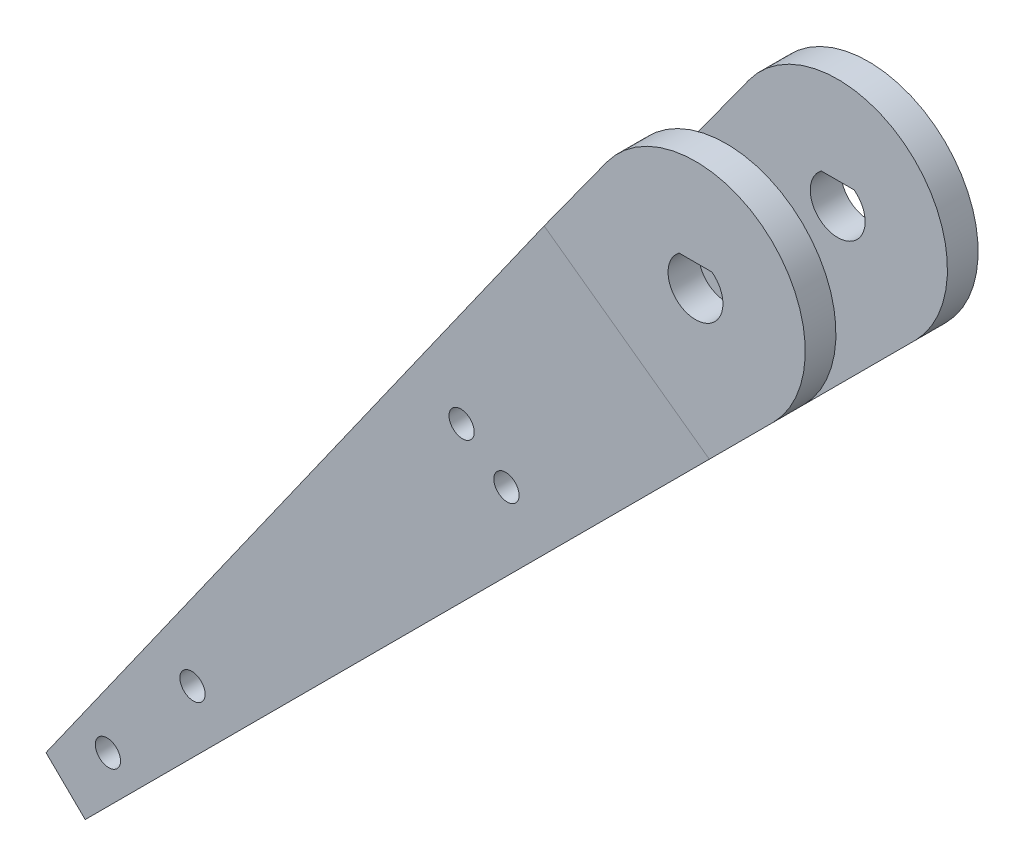
ISO-10303-21;
HEADER;
FILE_DESCRIPTION(('STEP AP214'),'2;1');
FILE_NAME('part.step','',(''),(''),'','','');
FILE_SCHEMA(('AUTOMOTIVE_DESIGN { 1 0 10303 214 1 1 1 1 }'));
ENDSEC;
DATA;
#1=APPLICATION_CONTEXT('core data for automotive mechanical design processes');
#2=APPLICATION_PROTOCOL_DEFINITION('international standard','automotive_design',2000,#1);
#3=PRODUCT_CONTEXT('',#1,'mechanical');
#4=PRODUCT('Part','Part','',(#3));
#5=PRODUCT_RELATED_PRODUCT_CATEGORY('part','',(#4));
#6=PRODUCT_DEFINITION_FORMATION('','',#4);
#7=PRODUCT_DEFINITION_CONTEXT('part definition',#1,'design');
#8=PRODUCT_DEFINITION('design','',#6,#7);
#9=PRODUCT_DEFINITION_SHAPE('','',#8);
#10=(LENGTH_UNIT() NAMED_UNIT(*) SI_UNIT(.MILLI.,.METRE.));
#11=(NAMED_UNIT(*) PLANE_ANGLE_UNIT() SI_UNIT($,.RADIAN.));
#12=(NAMED_UNIT(*) SI_UNIT($,.STERADIAN.) SOLID_ANGLE_UNIT());
#13=UNCERTAINTY_MEASURE_WITH_UNIT(LENGTH_MEASURE(1.E-05),#10,'distance_accuracy_value','');
#14=(GEOMETRIC_REPRESENTATION_CONTEXT(3) GLOBAL_UNCERTAINTY_ASSIGNED_CONTEXT((#13)) GLOBAL_UNIT_ASSIGNED_CONTEXT((#10,
#11,#12)) REPRESENTATION_CONTEXT('',''));
#15=CARTESIAN_POINT('',(0.,0.,0.));
#16=DIRECTION('',(0.,0.,1.));
#17=DIRECTION('',(1.,0.,0.));
#18=AXIS2_PLACEMENT_3D('',#15,#16,#17);
#19=CARTESIAN_POINT('',(77.8498963556851,91.3202805372886,10.));
#20=DIRECTION('',(0.,0.,-1.));
#21=DIRECTION('',(1.,0.,0.));
#22=AXIS2_PLACEMENT_3D('',#19,#20,#21);
#23=PLANE('',#22);
#24=DIRECTION('',(-0.810292579282322,0.586025542071336,0.));
#25=VECTOR('',#24,1.);
#26=CARTESIAN_POINT('',(123.400459016312,43.1747494764171,10.));
#27=LINE('',#26,#25);
#28=CARTESIAN_POINT('',(79.4506035200129,74.9604754594781,10.));
#29=VERTEX_POINT('',#28);
#30=CARTESIAN_POINT('',(60.3404163726786,88.7814804500709,10.));
#31=VERTEX_POINT('',#30);
#32=EDGE_CURVE('E433',#29,#31,#27,.T.);
#33=ORIENTED_EDGE('',*,*,#32,.F.);
#34=DIRECTION('',(0.707106781186549,0.707106781186546,0.));
#35=VECTOR('',#34,1.);
#36=CARTESIAN_POINT('',(2.24506403026728,-2.24506403026729,10.));
#37=LINE('',#36,#35);
#38=CARTESIAN_POINT('',(86.8301524767542,82.3400244162194,10.));
#39=VERTEX_POINT('',#38);
#40=EDGE_CURVE('E445',#29,#39,#37,.T.);
#41=ORIENTED_EDGE('',*,*,#40,.T.);
#42=CARTESIAN_POINT('',(77.8498963556851,91.3202805372886,10.));
#43=DIRECTION('',(0.,0.,1.));
#44=DIRECTION('',(1.,0.,0.));
#45=AXIS2_PLACEMENT_3D('',#42,#43,#44);
#46=CIRCLE('',#45,12.7);
#47=CARTESIAN_POINT('',(67.5591805987996,98.7628049215945,10.));
#48=VERTEX_POINT('',#47);
#49=EDGE_CURVE('E452',#39,#48,#46,.T.);
#50=ORIENTED_EDGE('',*,*,#49,.T.);
#51=DIRECTION('',(-0.586025542071336,-0.810292579282321,0.));
#52=VECTOR('',#51,1.);
#53=CARTESIAN_POINT('',(67.5591805987996,98.7628049215945,10.));
#54=LINE('',#53,#52);
#55=EDGE_CURVE('E449',#48,#31,#54,.T.);
#56=ORIENTED_EDGE('',*,*,#55,.T.);
#57=EDGE_LOOP('',(#33,#41,#50,#56));
#58=FACE_BOUND('',#57,.T.);
#59=CARTESIAN_POINT('',(77.8498963556851,91.3202805372886,10.));
#60=DIRECTION('',(0.,0.,-1.));
#61=DIRECTION('',(-1.,0.,0.));
#62=AXIS2_PLACEMENT_3D('',#59,#60,#61);
#63=CIRCLE('',#62,3.175);
#64=CARTESIAN_POINT('',(79.7448963556851,93.8677498697831,10.));
#65=VERTEX_POINT('',#64);
#66=CARTESIAN_POINT('',(75.9548963556851,93.8677498697831,10.));
#67=VERTEX_POINT('',#66);
#68=EDGE_CURVE('E396',#65,#67,#63,.T.);
#69=ORIENTED_EDGE('',*,*,#68,.T.);
#70=DIRECTION('',(1.,0.,0.));
#71=VECTOR('',#70,1.);
#72=CARTESIAN_POINT('',(75.9548963556851,93.8677498697831,10.));
#73=LINE('',#72,#71);
#74=EDGE_CURVE('E387',#67,#65,#73,.T.);
#75=ORIENTED_EDGE('',*,*,#74,.T.);
#76=EDGE_LOOP('',(#69,#75));
#77=FACE_BOUND('',#76,.T.);
#78=ADVANCED_FACE('F249',(#58,#77),#23,.F.);
#79=CARTESIAN_POINT('',(60.5199183520579,-43.7696442805761,6.45));
#80=DIRECTION('',(0.,0.,-1.));
#81=DIRECTION('',(-1.,0.,0.));
#82=AXIS2_PLACEMENT_3D('',#79,#80,#81);
#83=PLANE('',#82);
#84=DIRECTION('',(-0.707106781186549,-0.707106781186546,0.));
#85=VECTOR('',#84,1.);
#86=CARTESIAN_POINT('',(10.6202010660083,6.13007300547368,6.45));
#87=LINE('',#86,#85);
#88=CARTESIAN_POINT('',(86.8301524767542,82.3400244162194,6.45));
#89=VERTEX_POINT('',#88);
#90=CARTESIAN_POINT('',(68.7210810698613,64.2309530093265,6.45));
#91=VERTEX_POINT('',#90);
#92=EDGE_CURVE('E424',#89,#91,#87,.T.);
#93=ORIENTED_EDGE('',*,*,#92,.T.);
#94=DIRECTION('',(-0.810292579282322,0.586025542071336,0.));
#95=VECTOR('',#94,1.);
#96=CARTESIAN_POINT('',(114.620725943886,31.0350865335333,6.45));
#97=LINE('',#96,#95);
#98=CARTESIAN_POINT('',(51.5606833002522,76.6418175071872,6.45));
#99=VERTEX_POINT('',#98);
#100=EDGE_CURVE('E420',#91,#99,#97,.T.);
#101=ORIENTED_EDGE('',*,*,#100,.T.);
#102=DIRECTION('',(-0.586025542071336,-0.810292579282322,0.));
#103=VECTOR('',#102,1.);
#104=CARTESIAN_POINT('',(-2.54012429157569,1.83708669307776,6.45));
#105=LINE('',#104,#103);
#106=CARTESIAN_POINT('',(67.5591805987996,98.7628049215945,6.45));
#107=VERTEX_POINT('',#106);
#108=EDGE_CURVE('E417',#107,#99,#105,.T.);
#109=ORIENTED_EDGE('',*,*,#108,.F.);
#110=CARTESIAN_POINT('',(77.8498963556851,91.3202805372886,6.45));
#111=DIRECTION('',(0.,0.,-1.));
#112=DIRECTION('',(-1.,0.,0.));
#113=AXIS2_PLACEMENT_3D('',#110,#111,#112);
#114=CIRCLE('',#113,12.7);
#115=EDGE_CURVE('E409',#89,#107,#114,.F.);
#116=ORIENTED_EDGE('',*,*,#115,.F.);
#117=EDGE_LOOP('',(#93,#101,#109,#116));
#118=FACE_BOUND('',#117,.T.);
#119=DIRECTION('',(-1.,0.,0.));
#120=VECTOR('',#119,1.);
#121=CARTESIAN_POINT('',(75.9548963556851,93.8677498697831,6.45));
#122=LINE('',#121,#120);
#123=CARTESIAN_POINT('',(79.7448963556851,93.8677498697831,6.45));
#124=VERTEX_POINT('',#123);
#125=CARTESIAN_POINT('',(75.9548963556851,93.8677498697831,6.45));
#126=VERTEX_POINT('',#125);
#127=EDGE_CURVE('E397',#124,#126,#122,.T.);
#128=ORIENTED_EDGE('',*,*,#127,.T.);
#129=CARTESIAN_POINT('',(77.8498963556851,91.3202805372886,6.45));
#130=DIRECTION('',(0.,0.,1.));
#131=DIRECTION('',(1.,0.,0.));
#132=AXIS2_PLACEMENT_3D('',#129,#130,#131);
#133=CIRCLE('',#132,3.175);
#134=EDGE_CURVE('E273',#126,#124,#133,.T.);
#135=ORIENTED_EDGE('',*,*,#134,.T.);
#136=EDGE_LOOP('',(#128,#135));
#137=FACE_BOUND('',#136,.T.);
#138=ADVANCED_FACE('F581',(#118,#137),#83,.T.);
#139=CARTESIAN_POINT('',(2.24506403026728,-2.24506403026729,-10.));
#140=DIRECTION('',(0.707106781186546,-0.707106781186549,0.));
#141=DIRECTION('',(0.707106781186549,0.707106781186546,0.));
#142=AXIS2_PLACEMENT_3D('',#139,#140,#141);
#143=PLANE('',#142);
#144=DIRECTION('',(-0.706113128718452,-0.706113128718449,-0.0529952724578474));
#145=VECTOR('',#144,1.);
#146=CARTESIAN_POINT('',(10.5420140819614,6.05188602142685,2.08353890337242));
#147=LINE('',#146,#145);
#148=CARTESIAN_POINT('',(57.7506774525737,53.2605493920389,5.6266481813957));
#149=VERTEX_POINT('',#148);
#150=CARTESIAN_POINT('',(25.7509304412686,21.260802380734,3.225));
#151=VERTEX_POINT('',#150);
#152=EDGE_CURVE('E435',#149,#151,#147,.T.);
#153=ORIENTED_EDGE('',*,*,#152,.F.);
#154=DIRECTION('',(0.,0.,1.));
#155=VECTOR('',#154,1.);
#156=CARTESIAN_POINT('',(57.7506774525737,53.2605493920389,1.83788912642371E-13));
#157=LINE('',#156,#155);
#158=CARTESIAN_POINT('',(57.7506774525737,53.2605493920389,-5.6266481813957));
#159=VERTEX_POINT('',#158);
#160=EDGE_CURVE('E511',#159,#149,#157,.T.);
#161=ORIENTED_EDGE('',*,*,#160,.F.);
#162=DIRECTION('',(-0.706113128718452,-0.706113128718449,0.0529952724578474));
#163=VECTOR('',#162,1.);
#164=CARTESIAN_POINT('',(10.5420140819614,6.05188602142685,-2.08353890337242));
#165=LINE('',#164,#163);
#166=CARTESIAN_POINT('',(25.7509304412686,21.260802380734,-3.225));
#167=VERTEX_POINT('',#166);
#168=EDGE_CURVE('E523',#159,#167,#165,.T.);
#169=ORIENTED_EDGE('',*,*,#168,.T.);
#170=DIRECTION('',(0.,0.,1.));
#171=VECTOR('',#170,1.);
#172=CARTESIAN_POINT('',(25.7509304412687,21.260802380734,0.));
#173=LINE('',#172,#171);
#174=EDGE_CURVE('E509',#167,#151,#173,.T.);
#175=ORIENTED_EDGE('',*,*,#174,.T.);
#176=EDGE_LOOP('',(#153,#161,#169,#175));
#177=FACE_BOUND('',#176,.T.);
#178=DIRECTION('',(-0.706113128718452,-0.706113128718449,-0.0529952724578474));
#179=VECTOR('',#178,1.);
#180=CARTESIAN_POINT('',(10.5420140819614,6.05188602142685,2.08353890337242));
#181=LINE('',#180,#179);
#182=CARTESIAN_POINT('',(62.0476925154329,57.5575644548981,5.9491481813957));
#183=VERTEX_POINT('',#182);
#184=EDGE_CURVE('E411',#91,#183,#181,.T.);
#185=ORIENTED_EDGE('',*,*,#184,.F.);
#186=ORIENTED_EDGE('',*,*,#92,.F.);
#187=DIRECTION('',(0.,0.,-1.));
#188=VECTOR('',#187,1.);
#189=CARTESIAN_POINT('',(86.8301524767542,82.3400244162194,10.));
#190=LINE('',#189,#188);
#191=EDGE_CURVE('E455',#39,#89,#190,.T.);
#192=ORIENTED_EDGE('',*,*,#191,.F.);
#193=ORIENTED_EDGE('',*,*,#40,.F.);
#194=DIRECTION('',(0.706366518785737,0.706366518785735,0.045745844369079));
#195=VECTOR('',#194,1.);
#196=CARTESIAN_POINT('',(10.4411079009863,5.9509798404517,5.53079376977915));
#197=LINE('',#196,#195);
#198=CARTESIAN_POINT('',(2.24506403026731,-2.24506403026731,5.));
#199=VERTEX_POINT('',#198);
#200=EDGE_CURVE('E428',#199,#29,#197,.T.);
#201=ORIENTED_EDGE('',*,*,#200,.F.);
#202=DIRECTION('',(0.,0.,1.));
#203=VECTOR('',#202,1.);
#204=CARTESIAN_POINT('',(2.24506403026728,-2.24506403026729,-10.));
#205=LINE('',#204,#203);
#206=CARTESIAN_POINT('',(2.2450640302673,-2.2450640302673,-5.));
#207=VERTEX_POINT('',#206);
#208=EDGE_CURVE('E12',#207,#199,#205,.T.);
#209=ORIENTED_EDGE('',*,*,#208,.F.);
#210=DIRECTION('',(0.706366518785737,0.706366518785735,-0.045745844369079));
#211=VECTOR('',#210,1.);
#212=CARTESIAN_POINT('',(10.2518913830781,5.76176332254347,-5.51853969324793));
#213=LINE('',#212,#211);
#214=CARTESIAN_POINT('',(79.4506035200129,74.9604754594781,-10.));
#215=VERTEX_POINT('',#214);
#216=EDGE_CURVE('E476',#207,#215,#213,.T.);
#217=ORIENTED_EDGE('',*,*,#216,.T.);
#218=DIRECTION('',(0.707106781186549,0.707106781186546,0.));
#219=VECTOR('',#218,1.);
#220=CARTESIAN_POINT('',(2.24506403026728,-2.24506403026729,-10.));
#221=LINE('',#220,#219);
#222=CARTESIAN_POINT('',(86.8301524767542,82.3400244162194,-10.));
#223=VERTEX_POINT('',#222);
#224=EDGE_CURVE('E527',#215,#223,#221,.T.);
#225=ORIENTED_EDGE('',*,*,#224,.T.);
#226=DIRECTION('',(0.,0.,1.));
#227=VECTOR('',#226,1.);
#228=CARTESIAN_POINT('',(86.8301524767542,82.3400244162194,-10.));
#229=LINE('',#228,#227);
#230=CARTESIAN_POINT('',(86.8301524767542,82.3400244162194,-6.45));
#231=VERTEX_POINT('',#230);
#232=EDGE_CURVE('E534',#223,#231,#229,.T.);
#233=ORIENTED_EDGE('',*,*,#232,.T.);
#234=DIRECTION('',(-0.707106781186549,-0.707106781186546,0.));
#235=VECTOR('',#234,1.);
#236=CARTESIAN_POINT('',(10.6202010660083,6.13007300547368,-6.45));
#237=LINE('',#236,#235);
#238=CARTESIAN_POINT('',(68.7210810698613,64.2309530093265,-6.45));
#239=VERTEX_POINT('',#238);
#240=EDGE_CURVE('E500',#231,#239,#237,.T.);
#241=ORIENTED_EDGE('',*,*,#240,.T.);
#242=DIRECTION('',(-0.706113128718452,-0.706113128718449,0.0529952724578474));
#243=VECTOR('',#242,1.);
#244=CARTESIAN_POINT('',(10.5420140819614,6.05188602142685,-2.08353890337242));
#245=LINE('',#244,#243);
#246=CARTESIAN_POINT('',(62.0476925154329,57.5575644548981,-5.9491481813957));
#247=VERTEX_POINT('',#246);
#248=EDGE_CURVE('E503',#239,#247,#245,.T.);
#249=ORIENTED_EDGE('',*,*,#248,.T.);
#250=DIRECTION('',(0.,0.,1.));
#251=VECTOR('',#250,1.);
#252=CARTESIAN_POINT('',(62.0476925154329,57.5575644548981,-1.89497192169139E-13));
#253=LINE('',#252,#251);
#254=EDGE_CURVE('E483',#247,#183,#253,.T.);
#255=ORIENTED_EDGE('',*,*,#254,.T.);
#256=EDGE_LOOP('',(#185,#186,#192,#193,#201,#209,#217,#225,#233,#241,#249,#255));
#257=FACE_BOUND('',#256,.T.);
#258=ADVANCED_FACE('F251',(#177,#257),#143,.T.);
#259=CARTESIAN_POINT('',(67.5591805987996,98.7628049215945,-10.));
#260=DIRECTION('',(-0.810292579282322,0.586025542071336,0.));
#261=DIRECTION('',(-0.586025542071336,-0.810292579282322,0.));
#262=AXIS2_PLACEMENT_3D('',#259,#260,#261);
#263=PLANE('',#262);
#264=DIRECTION('',(0.,0.,1.));
#265=VECTOR('',#264,1.);
#266=CARTESIAN_POINT('',(42.5838424479172,64.2296152978165,2.09622180126904E-13));
#267=LINE('',#266,#265);
#268=CARTESIAN_POINT('',(42.5838424479172,64.2296152978166,-5.6266481813957));
#269=VERTEX_POINT('',#268);
#270=CARTESIAN_POINT('',(42.5838424479172,64.2296152978166,5.6266481813957));
#271=VERTEX_POINT('',#270);
#272=EDGE_CURVE('E513',#269,#271,#267,.T.);
#273=ORIENTED_EDGE('',*,*,#272,.T.);
#274=DIRECTION('',(-0.58518083972091,-0.809124616459689,-0.0536725242791041));
#275=VECTOR('',#274,1.);
#276=CARTESIAN_POINT('',(-2.58685639529089,1.77247060702657,1.48361193379322));
#277=LINE('',#276,#275);
#278=CARTESIAN_POINT('',(16.399150775972,28.0242627502479,3.225));
#279=VERTEX_POINT('',#278);
#280=EDGE_CURVE('E438',#271,#279,#277,.T.);
#281=ORIENTED_EDGE('',*,*,#280,.T.);
#282=DIRECTION('',(0.,0.,1.));
#283=VECTOR('',#282,1.);
#284=CARTESIAN_POINT('',(16.399150775972,28.0242627502478,0.));
#285=LINE('',#284,#283);
#286=CARTESIAN_POINT('',(16.399150775972,28.0242627502479,-3.225));
#287=VERTEX_POINT('',#286);
#288=EDGE_CURVE('E518',#287,#279,#285,.T.);
#289=ORIENTED_EDGE('',*,*,#288,.F.);
#290=DIRECTION('',(-0.58518083972091,-0.809124616459689,0.0536725242791041));
#291=VECTOR('',#290,1.);
#292=CARTESIAN_POINT('',(-2.58685639529089,1.77247060702657,-1.48361193379322));
#293=LINE('',#292,#291);
#294=EDGE_CURVE('E515',#269,#287,#293,.T.);
#295=ORIENTED_EDGE('',*,*,#294,.F.);
#296=EDGE_LOOP('',(#273,#281,#289,#295));
#297=FACE_BOUND('',#296,.T.);
#298=DIRECTION('',(0.,0.,-1.));
#299=VECTOR('',#298,1.);
#300=CARTESIAN_POINT('',(67.5591805987996,98.7628049215945,10.));
#301=LINE('',#300,#299);
#302=EDGE_CURVE('E454',#48,#107,#301,.T.);
#303=ORIENTED_EDGE('',*,*,#302,.T.);
#304=ORIENTED_EDGE('',*,*,#108,.T.);
#305=DIRECTION('',(-0.58518083972091,-0.809124616459689,-0.0536725242791041));
#306=VECTOR('',#305,1.);
#307=CARTESIAN_POINT('',(-2.58685639529089,1.77247060702657,1.48361193379322));
#308=LINE('',#307,#306);
#309=CARTESIAN_POINT('',(46.0999957003451,69.0913707735104,5.9491481813957));
#310=VERTEX_POINT('',#309);
#311=EDGE_CURVE('E414',#99,#310,#308,.T.);
#312=ORIENTED_EDGE('',*,*,#311,.T.);
#313=DIRECTION('',(0.,0.,1.));
#314=VECTOR('',#313,1.);
#315=CARTESIAN_POINT('',(46.0999957003452,69.0913707735104,-2.13531693707509E-13));
#316=LINE('',#315,#314);
#317=CARTESIAN_POINT('',(46.0999957003451,69.0913707735104,-5.9491481813957));
#318=VERTEX_POINT('',#317);
#319=EDGE_CURVE('E495',#318,#310,#316,.T.);
#320=ORIENTED_EDGE('',*,*,#319,.F.);
#321=DIRECTION('',(-0.58518083972091,-0.809124616459689,0.0536725242791041));
#322=VECTOR('',#321,1.);
#323=CARTESIAN_POINT('',(-2.58685639529089,1.77247060702657,-1.48361193379322));
#324=LINE('',#323,#322);
#325=CARTESIAN_POINT('',(51.5606833002522,76.6418175071872,-6.45));
#326=VERTEX_POINT('',#325);
#327=EDGE_CURVE('E497',#326,#318,#324,.T.);
#328=ORIENTED_EDGE('',*,*,#327,.F.);
#329=DIRECTION('',(-0.586025542071336,-0.810292579282322,0.));
#330=VECTOR('',#329,1.);
#331=CARTESIAN_POINT('',(-2.54012429157569,1.83708669307776,-6.45));
#332=LINE('',#331,#330);
#333=CARTESIAN_POINT('',(67.5591805987996,98.7628049215945,-6.45));
#334=VERTEX_POINT('',#333);
#335=EDGE_CURVE('E491',#334,#326,#332,.T.);
#336=ORIENTED_EDGE('',*,*,#335,.F.);
#337=DIRECTION('',(0.,0.,1.));
#338=VECTOR('',#337,1.);
#339=CARTESIAN_POINT('',(67.5591805987996,98.7628049215945,-10.));
#340=LINE('',#339,#338);
#341=CARTESIAN_POINT('',(67.5591805987996,98.7628049215945,-10.));
#342=VERTEX_POINT('',#341);
#343=EDGE_CURVE('E538',#342,#334,#340,.T.);
#344=ORIENTED_EDGE('',*,*,#343,.F.);
#345=DIRECTION('',(-0.586025542071336,-0.810292579282321,0.));
#346=VECTOR('',#345,1.);
#347=CARTESIAN_POINT('',(67.5591805987996,98.7628049215945,-10.));
#348=LINE('',#347,#346);
#349=CARTESIAN_POINT('',(60.3404163726786,88.7814804500709,-10.));
#350=VERTEX_POINT('',#349);
#351=EDGE_CURVE('E532',#342,#350,#348,.T.);
#352=ORIENTED_EDGE('',*,*,#351,.T.);
#353=DIRECTION('',(0.58539623748748,0.809422445136626,-0.0463308800320894));
#354=VECTOR('',#353,1.);
#355=CARTESIAN_POINT('',(-2.67636726756212,1.64870467813873,-5.0125695112508));
#356=LINE('',#355,#354);
#357=CARTESIAN_POINT('',(-2.24506403026727,2.2450640302673,-5.04670478111575));
#358=VERTEX_POINT('',#357);
#359=EDGE_CURVE('E480',#358,#350,#356,.T.);
#360=ORIENTED_EDGE('',*,*,#359,.F.);
#361=DIRECTION('',(0.,0.,1.));
#362=VECTOR('',#361,1.);
#363=CARTESIAN_POINT('',(-2.24506403026728,2.24506403026729,-10.));
#364=LINE('',#363,#362);
#365=CARTESIAN_POINT('',(-2.24506403026728,2.24506403026729,5.04670478111575));
#366=VERTEX_POINT('',#365);
#367=EDGE_CURVE('E258',#358,#366,#364,.T.);
#368=ORIENTED_EDGE('',*,*,#367,.T.);
#369=DIRECTION('',(0.58539623748748,0.809422445136626,0.0463308800320894));
#370=VECTOR('',#369,1.);
#371=CARTESIAN_POINT('',(-2.67636726756212,1.64870467813873,5.0125695112508));
#372=LINE('',#371,#370);
#373=EDGE_CURVE('E430',#366,#31,#372,.T.);
#374=ORIENTED_EDGE('',*,*,#373,.T.);
#375=ORIENTED_EDGE('',*,*,#55,.F.);
#376=EDGE_LOOP('',(#303,#304,#312,#320,#328,#336,#344,#352,#360,#368,#374,#375));
#377=FACE_BOUND('',#376,.T.);
#378=ADVANCED_FACE('F642',(#297,#377),#263,.T.);
#379=CARTESIAN_POINT('',(-2.24506403026728,2.24506403026729,-10.));
#380=DIRECTION('',(-0.707106781186549,-0.707106781186546,0.));
#381=DIRECTION('',(0.707106781186546,-0.707106781186549,0.));
#382=AXIS2_PLACEMENT_3D('',#379,#380,#381);
#383=PLANE('',#382);
#384=ORIENTED_EDGE('',*,*,#208,.T.);
#385=DIRECTION('',(0.707087655694468,-0.70708765569447,-0.00735488470342747));
#386=VECTOR('',#385,1.);
#387=CARTESIAN_POINT('',(52.1985375084468,-52.1985375084469,4.48040100119286));
#388=LINE('',#387,#386);
#389=EDGE_CURVE('E393',#366,#199,#388,.T.);
#390=ORIENTED_EDGE('',*,*,#389,.F.);
#391=ORIENTED_EDGE('',*,*,#367,.F.);
#392=DIRECTION('',(0.707087655694468,-0.70708765569447,0.00735488470342747));
#393=VECTOR('',#392,1.);
#394=CARTESIAN_POINT('',(52.1985375084468,-52.1985375084469,-4.48040100119286));
#395=LINE('',#394,#393);
#396=EDGE_CURVE('E479',#358,#207,#395,.T.);
#397=ORIENTED_EDGE('',*,*,#396,.T.);
#398=EDGE_LOOP('',(#384,#390,#391,#397));
#399=FACE_BOUND('',#398,.T.);
#400=ADVANCED_FACE('F598',(#399),#383,.T.);
#401=CARTESIAN_POINT('',(77.8498963556851,91.3202805372886,10.));
#402=DIRECTION('',(0.,0.,-1.));
#403=DIRECTION('',(-1.,0.,0.));
#404=AXIS2_PLACEMENT_3D('',#401,#402,#403);
#405=CYLINDRICAL_SURFACE('',#404,12.7);
#406=ORIENTED_EDGE('',*,*,#115,.T.);
#407=ORIENTED_EDGE('',*,*,#302,.F.);
#408=ORIENTED_EDGE('',*,*,#49,.F.);
#409=ORIENTED_EDGE('',*,*,#191,.T.);
#410=EDGE_LOOP('',(#406,#407,#408,#409));
#411=FACE_BOUND('',#410,.T.);
#412=ADVANCED_FACE('F594',(#411),#405,.T.);
#413=CARTESIAN_POINT('',(77.8498963556851,91.3202805372886,-10.));
#414=DIRECTION('',(0.,0.,1.));
#415=DIRECTION('',(1.,0.,0.));
#416=AXIS2_PLACEMENT_3D('',#413,#414,#415);
#417=CYLINDRICAL_SURFACE('',#416,12.7);
#418=CARTESIAN_POINT('',(77.8498963556851,91.3202805372886,-6.45));
#419=DIRECTION('',(0.,0.,-1.));
#420=DIRECTION('',(-1.,0.,0.));
#421=AXIS2_PLACEMENT_3D('',#418,#419,#420);
#422=CIRCLE('',#421,12.7);
#423=EDGE_CURVE('E506',#334,#231,#422,.T.);
#424=ORIENTED_EDGE('',*,*,#423,.T.);
#425=ORIENTED_EDGE('',*,*,#232,.F.);
#426=CARTESIAN_POINT('',(77.8498963556851,91.3202805372886,-10.));
#427=DIRECTION('',(0.,0.,1.));
#428=DIRECTION('',(1.,0.,0.));
#429=AXIS2_PLACEMENT_3D('',#426,#427,#428);
#430=CIRCLE('',#429,12.7);
#431=EDGE_CURVE('E529',#223,#342,#430,.T.);
#432=ORIENTED_EDGE('',*,*,#431,.T.);
#433=ORIENTED_EDGE('',*,*,#343,.T.);
#434=EDGE_LOOP('',(#424,#425,#432,#433));
#435=FACE_BOUND('',#434,.T.);
#436=ADVANCED_FACE('F597',(#435),#417,.T.);
#437=CARTESIAN_POINT('',(77.8498963556851,91.3202805372886,-10.));
#438=DIRECTION('',(0.,0.,1.));
#439=DIRECTION('',(1.,0.,0.));
#440=AXIS2_PLACEMENT_3D('',#437,#438,#439);
#441=PLANE('',#440);
#442=DIRECTION('',(1.,0.,0.));
#443=VECTOR('',#442,1.);
#444=CARTESIAN_POINT('',(75.9548963556851,93.8677498697831,-10.));
#445=LINE('',#444,#443);
#446=CARTESIAN_POINT('',(75.9548963556851,93.8677498697831,-10.));
#447=VERTEX_POINT('',#446);
#448=CARTESIAN_POINT('',(79.7448963556851,93.8677498697831,-10.));
#449=VERTEX_POINT('',#448);
#450=EDGE_CURVE('E470',#447,#449,#445,.T.);
#451=ORIENTED_EDGE('',*,*,#450,.F.);
#452=CARTESIAN_POINT('',(77.8498963556851,91.3202805372886,-10.));
#453=DIRECTION('',(0.,0.,1.));
#454=DIRECTION('',(1.,0.,0.));
#455=AXIS2_PLACEMENT_3D('',#452,#453,#454);
#456=CIRCLE('',#455,3.175);
#457=EDGE_CURVE('E458',#449,#447,#456,.F.);
#458=ORIENTED_EDGE('',*,*,#457,.F.);
#459=EDGE_LOOP('',(#451,#458));
#460=FACE_BOUND('',#459,.T.);
#461=ORIENTED_EDGE('',*,*,#224,.F.);
#462=DIRECTION('',(-0.810292579282322,0.586025542071336,0.));
#463=VECTOR('',#462,1.);
#464=CARTESIAN_POINT('',(123.400459016312,43.1747494764171,-10.));
#465=LINE('',#464,#463);
#466=EDGE_CURVE('E475',#215,#350,#465,.T.);
#467=ORIENTED_EDGE('',*,*,#466,.T.);
#468=ORIENTED_EDGE('',*,*,#351,.F.);
#469=ORIENTED_EDGE('',*,*,#431,.F.);
#470=EDGE_LOOP('',(#461,#467,#468,#469));
#471=FACE_BOUND('',#470,.T.);
#472=ADVANCED_FACE('F635',(#460,#471),#441,.F.);
#473=CARTESIAN_POINT('',(105.643885091551,18.6228843241627,2.09622180126904E-13));
#474=DIRECTION('',(-0.586025542071336,-0.810292579282322,0.));
#475=DIRECTION('',(0.810292579282322,-0.586025542071336,0.));
#476=AXIS2_PLACEMENT_3D('',#473,#474,#475);
#477=PLANE('',#476);
#478=ORIENTED_EDGE('',*,*,#160,.T.);
#479=DIRECTION('',(-0.810292579282322,0.586025542071336,0.));
#480=VECTOR('',#479,1.);
#481=CARTESIAN_POINT('',(105.643885091551,18.6228843241627,5.6266481813957));
#482=LINE('',#481,#480);
#483=EDGE_CURVE('E442',#149,#271,#482,.T.);
#484=ORIENTED_EDGE('',*,*,#483,.T.);
#485=ORIENTED_EDGE('',*,*,#272,.F.);
#486=DIRECTION('',(-0.810292579282322,0.586025542071336,0.));
#487=VECTOR('',#486,1.);
#488=CARTESIAN_POINT('',(105.643885091551,18.6228843241627,-5.6266481813957));
#489=LINE('',#488,#487);
#490=EDGE_CURVE('E520',#159,#269,#489,.T.);
#491=ORIENTED_EDGE('',*,*,#490,.F.);
#492=EDGE_LOOP('',(#478,#484,#485,#491));
#493=FACE_BOUND('',#492,.T.);
#494=ADVANCED_FACE('F628',(#493),#477,.T.);
#495=CARTESIAN_POINT('',(79.4591934196056,-17.582468223406,0.));
#496=DIRECTION('',(-0.586025542071336,-0.810292579282322,0.));
#497=DIRECTION('',(0.810292579282322,-0.586025542071336,0.));
#498=AXIS2_PLACEMENT_3D('',#495,#496,#497);
#499=PLANE('',#498);
#500=DIRECTION('',(-0.810292579282322,0.586025542071336,0.));
#501=VECTOR('',#500,1.);
#502=CARTESIAN_POINT('',(79.4591934196056,-17.5824682234059,-3.225));
#503=LINE('',#502,#501);
#504=EDGE_CURVE('E521',#167,#287,#503,.T.);
#505=ORIENTED_EDGE('',*,*,#504,.T.);
#506=ORIENTED_EDGE('',*,*,#288,.T.);
#507=DIRECTION('',(-0.810292579282322,0.586025542071336,0.));
#508=VECTOR('',#507,1.);
#509=CARTESIAN_POINT('',(79.4591934196056,-17.5824682234059,3.225));
#510=LINE('',#509,#508);
#511=EDGE_CURVE('E441',#151,#279,#510,.T.);
#512=ORIENTED_EDGE('',*,*,#511,.F.);
#513=ORIENTED_EDGE('',*,*,#174,.F.);
#514=EDGE_LOOP('',(#505,#506,#512,#513));
#515=FACE_BOUND('',#514,.T.);
#516=ADVANCED_FACE('F625',(#515),#499,.F.);
#517=CARTESIAN_POINT('',(60.4731862483426,-43.8342603666272,-1.48361193379322));
#518=DIRECTION('',(-0.0314534701349989,-0.0434904481347083,-0.998558591239147));
#519=DIRECTION('',(0.,0.999052905429821,-0.0435119771124372));
#520=AXIS2_PLACEMENT_3D('',#517,#518,#519);
#521=PLANE('',#520);
#522=ORIENTED_EDGE('',*,*,#490,.T.);
#523=ORIENTED_EDGE('',*,*,#294,.T.);
#524=ORIENTED_EDGE('',*,*,#504,.F.);
#525=ORIENTED_EDGE('',*,*,#168,.F.);
#526=EDGE_LOOP('',(#522,#523,#524,#525));
#527=FACE_BOUND('',#526,.T.);
#528=ADVANCED_FACE('F623',(#527),#521,.F.);
#529=CARTESIAN_POINT('',(60.5199183520579,-43.769644280576,-6.45));
#530=DIRECTION('',(0.,0.,-1.));
#531=DIRECTION('',(-1.,0.,0.));
#532=AXIS2_PLACEMENT_3D('',#529,#530,#531);
#533=PLANE('',#532);
#534=DIRECTION('',(-1.,0.,0.));
#535=VECTOR('',#534,1.);
#536=CARTESIAN_POINT('',(75.9548963556851,93.8677498697831,-6.45));
#537=LINE('',#536,#535);
#538=CARTESIAN_POINT('',(79.7448963556851,93.8677498697831,-6.45));
#539=VERTEX_POINT('',#538);
#540=CARTESIAN_POINT('',(75.9548963556851,93.8677498697831,-6.45));
#541=VERTEX_POINT('',#540);
#542=EDGE_CURVE('E464',#539,#541,#537,.T.);
#543=ORIENTED_EDGE('',*,*,#542,.F.);
#544=CARTESIAN_POINT('',(77.8498963556851,91.3202805372886,-6.45));
#545=DIRECTION('',(0.,0.,1.));
#546=DIRECTION('',(1.,0.,0.));
#547=AXIS2_PLACEMENT_3D('',#544,#545,#546);
#548=CIRCLE('',#547,3.175);
#549=EDGE_CURVE('E462',#541,#539,#548,.T.);
#550=ORIENTED_EDGE('',*,*,#549,.F.);
#551=EDGE_LOOP('',(#543,#550));
#552=FACE_BOUND('',#551,.T.);
#553=ORIENTED_EDGE('',*,*,#423,.F.);
#554=ORIENTED_EDGE('',*,*,#335,.T.);
#555=DIRECTION('',(-0.810292579282322,0.586025542071336,0.));
#556=VECTOR('',#555,1.);
#557=CARTESIAN_POINT('',(114.620725943886,31.0350865335333,-6.45));
#558=LINE('',#557,#556);
#559=EDGE_CURVE('E488',#239,#326,#558,.T.);
#560=ORIENTED_EDGE('',*,*,#559,.F.);
#561=ORIENTED_EDGE('',*,*,#240,.F.);
#562=EDGE_LOOP('',(#553,#554,#560,#561));
#563=FACE_BOUND('',#562,.T.);
#564=ADVANCED_FACE('F616',(#552,#563),#533,.F.);
#565=CARTESIAN_POINT('',(60.4731862483426,-43.8342603666272,-1.48361193379322));
#566=DIRECTION('',(-0.0314534701349989,-0.0434904481347083,-0.998558591239147));
#567=DIRECTION('',(0.,0.999052905429821,-0.0435119771124372));
#568=AXIS2_PLACEMENT_3D('',#565,#566,#567);
#569=PLANE('',#568);
#570=ORIENTED_EDGE('',*,*,#559,.T.);
#571=ORIENTED_EDGE('',*,*,#327,.T.);
#572=DIRECTION('',(-0.810292579282322,0.586025542071336,0.));
#573=VECTOR('',#572,1.);
#574=CARTESIAN_POINT('',(109.160038343979,23.4846397998566,-5.9491481813957));
#575=LINE('',#574,#573);
#576=EDGE_CURVE('E489',#247,#318,#575,.T.);
#577=ORIENTED_EDGE('',*,*,#576,.F.);
#578=ORIENTED_EDGE('',*,*,#248,.F.);
#579=EDGE_LOOP('',(#570,#571,#577,#578));
#580=FACE_BOUND('',#579,.T.);
#581=ADVANCED_FACE('F613',(#580),#569,.F.);
#582=CARTESIAN_POINT('',(109.160038343979,23.4846397998566,-2.13531693707509E-13));
#583=DIRECTION('',(-0.586025542071336,-0.810292579282322,0.));
#584=DIRECTION('',(0.810292579282322,-0.586025542071336,0.));
#585=AXIS2_PLACEMENT_3D('',#582,#583,#584);
#586=PLANE('',#585);
#587=ORIENTED_EDGE('',*,*,#576,.T.);
#588=ORIENTED_EDGE('',*,*,#319,.T.);
#589=DIRECTION('',(-0.810292579282322,0.586025542071336,0.));
#590=VECTOR('',#589,1.);
#591=CARTESIAN_POINT('',(109.160038343979,23.4846397998566,5.9491481813957));
#592=LINE('',#591,#590);
#593=EDGE_CURVE('E421',#183,#310,#592,.T.);
#594=ORIENTED_EDGE('',*,*,#593,.F.);
#595=ORIENTED_EDGE('',*,*,#254,.F.);
#596=EDGE_LOOP('',(#587,#588,#594,#595));
#597=FACE_BOUND('',#596,.T.);
#598=ADVANCED_FACE('F611',(#597),#586,.F.);
#599=CARTESIAN_POINT('',(60.3836753760714,-43.9580262955151,-5.0125695112508));
#600=DIRECTION('',(0.0271510790854472,0.0375415682816215,0.998926148198881));
#601=DIRECTION('',(0.,-0.999294546629796,0.0375554134040802));
#602=AXIS2_PLACEMENT_3D('',#599,#600,#601);
#603=PLANE('',#602);
#604=CARTESIAN_POINT('',(5.26876015215507,6.16063314137274,-5.39808715346625));
#605=DIRECTION('',(0.0271510790854472,0.0375415682816215,0.998926148198881));
#606=DIRECTION('',(-0.58539623748748,-0.809422445136626,0.0463308800320894));
#607=AXIS2_PLACEMENT_3D('',#604,#605,#606);
#608=ELLIPSE('',#607,1.50161250929769,1.5);
#609=CARTESIAN_POINT('',(4.38972183904807,4.94519427244926,-5.32851612444329));
#610=VERTEX_POINT('',#609);
#611=EDGE_CURVE('E399',#610,#610,#608,.T.);
#612=ORIENTED_EDGE('',*,*,#611,.T.);
#613=EDGE_LOOP('',(#612));
#614=FACE_BOUND('',#613,.T.);
#615=CARTESIAN_POINT('',(15.8062804564653,18.4818994241182,-6.14755667928299));
#616=DIRECTION('',(0.0271510790854472,0.0375415682816215,0.998926148198881));
#617=DIRECTION('',(-0.58539623748748,-0.809422445136626,0.0463308800320894));
#618=AXIS2_PLACEMENT_3D('',#615,#616,#617);
#619=ELLIPSE('',#618,1.50161250929769,1.5);
#620=CARTESIAN_POINT('',(14.9272421433582,17.2664605551947,-6.07798565026003));
#621=VERTEX_POINT('',#620);
#622=EDGE_CURVE('E552',#621,#621,#619,.T.);
#623=ORIENTED_EDGE('',*,*,#622,.T.);
#624=EDGE_LOOP('',(#623));
#625=FACE_BOUND('',#624,.T.);
#626=CARTESIAN_POINT('',(54.7134296807125,59.1595356275336,-8.7338072717822));
#627=DIRECTION('',(0.0271510790854472,0.0375415682816215,0.998926148198881));
#628=DIRECTION('',(-0.58539623748748,-0.809422445136626,0.0463308800320894));
#629=AXIS2_PLACEMENT_3D('',#626,#627,#628);
#630=ELLIPSE('',#629,1.5016125092977,1.5);
#631=CARTESIAN_POINT('',(53.8343913676055,57.9440967586101,-8.66423624275924));
#632=VERTEX_POINT('',#631);
#633=EDGE_CURVE('E549',#632,#632,#630,.T.);
#634=ORIENTED_EDGE('',*,*,#633,.T.);
#635=EDGE_LOOP('',(#634));
#636=FACE_BOUND('',#635,.T.);
#637=CARTESIAN_POINT('',(49.5276743774218,62.9100143315985,-8.7338072717822));
#638=DIRECTION('',(0.0271510790854472,0.0375415682816215,0.998926148198881));
#639=DIRECTION('',(-0.58539623748748,-0.809422445136626,0.0463308800320894));
#640=AXIS2_PLACEMENT_3D('',#637,#638,#639);
#641=ELLIPSE('',#640,1.5016125092977,1.5);
#642=CARTESIAN_POINT('',(48.6486360643148,61.694575462675,-8.66423624275924));
#643=VERTEX_POINT('',#642);
#644=EDGE_CURVE('E546',#643,#643,#641,.T.);
#645=ORIENTED_EDGE('',*,*,#644,.T.);
#646=EDGE_LOOP('',(#645));
#647=FACE_BOUND('',#646,.T.);
#648=ORIENTED_EDGE('',*,*,#359,.T.);
#649=ORIENTED_EDGE('',*,*,#466,.F.);
#650=ORIENTED_EDGE('',*,*,#216,.F.);
#651=ORIENTED_EDGE('',*,*,#396,.F.);
#652=EDGE_LOOP('',(#648,#649,#650,#651));
#653=FACE_BOUND('',#652,.T.);
#654=ADVANCED_FACE('F564',(#614,#625,#636,#647,#653),#603,.F.);
#655=CARTESIAN_POINT('',(77.8498963556851,91.3202805372886,-10.001));
#656=DIRECTION('',(0.,0.,1.));
#657=DIRECTION('',(1.,0.,0.));
#658=AXIS2_PLACEMENT_3D('',#655,#656,#657);
#659=CYLINDRICAL_SURFACE('',#658,3.175);
#660=ORIENTED_EDGE('',*,*,#457,.T.);
#661=DIRECTION('',(0.,0.,1.));
#662=VECTOR('',#661,1.);
#663=CARTESIAN_POINT('',(75.9548963556851,93.8677498697831,-10.001));
#664=LINE('',#663,#662);
#665=EDGE_CURVE('E468',#447,#541,#664,.T.);
#666=ORIENTED_EDGE('',*,*,#665,.T.);
#667=ORIENTED_EDGE('',*,*,#549,.T.);
#668=DIRECTION('',(0.,0.,1.));
#669=VECTOR('',#668,1.);
#670=CARTESIAN_POINT('',(79.7448963556851,93.8677498697831,-10.001));
#671=LINE('',#670,#669);
#672=EDGE_CURVE('E467',#449,#539,#671,.T.);
#673=ORIENTED_EDGE('',*,*,#672,.F.);
#674=EDGE_LOOP('',(#660,#666,#667,#673));
#675=FACE_BOUND('',#674,.T.);
#676=ADVANCED_FACE('F604',(#675),#659,.F.);
#677=CARTESIAN_POINT('',(75.9548963556851,93.8677498697831,-10.001));
#678=DIRECTION('',(0.,1.,0.));
#679=DIRECTION('',(0.,0.,1.));
#680=AXIS2_PLACEMENT_3D('',#677,#678,#679);
#681=PLANE('',#680);
#682=ORIENTED_EDGE('',*,*,#450,.T.);
#683=ORIENTED_EDGE('',*,*,#672,.T.);
#684=ORIENTED_EDGE('',*,*,#542,.T.);
#685=ORIENTED_EDGE('',*,*,#665,.F.);
#686=EDGE_LOOP('',(#682,#683,#684,#685));
#687=FACE_BOUND('',#686,.T.);
#688=ADVANCED_FACE('F600',(#687),#681,.F.);
#689=CARTESIAN_POINT('',(60.3836753760714,-43.9580262955151,5.0125695112508));
#690=DIRECTION('',(-0.0271510790854472,-0.0375415682816215,0.998926148198881));
#691=DIRECTION('',(0.,-0.999294546629796,-0.0375554134040802));
#692=AXIS2_PLACEMENT_3D('',#689,#690,#691);
#693=PLANE('',#692);
#694=CARTESIAN_POINT('',(5.26876015215507,6.16063314137274,5.39808715346624));
#695=DIRECTION('',(-0.0271510790854472,-0.0375415682816215,0.998926148198881));
#696=DIRECTION('',(0.58539623748748,0.809422445136626,0.0463308800320894));
#697=AXIS2_PLACEMENT_3D('',#694,#695,#696);
#698=ELLIPSE('',#697,1.50161250929769,1.5);
#699=CARTESIAN_POINT('',(6.14779846526208,7.37607201029623,5.4676581824892));
#700=VERTEX_POINT('',#699);
#701=EDGE_CURVE('E253',#700,#700,#698,.T.);
#702=ORIENTED_EDGE('',*,*,#701,.F.);
#703=EDGE_LOOP('',(#702));
#704=FACE_BOUND('',#703,.T.);
#705=CARTESIAN_POINT('',(15.8062804564653,18.4818994241182,6.14755667928299));
#706=DIRECTION('',(-0.0271510790854472,-0.0375415682816215,0.998926148198881));
#707=DIRECTION('',(0.58539623748748,0.809422445136626,0.0463308800320894));
#708=AXIS2_PLACEMENT_3D('',#705,#706,#707);
#709=ELLIPSE('',#708,1.50161250929769,1.5);
#710=CARTESIAN_POINT('',(16.6853187695723,19.6973382930417,6.21712770830594));
#711=VERTEX_POINT('',#710);
#712=EDGE_CURVE('E550',#711,#711,#709,.T.);
#713=ORIENTED_EDGE('',*,*,#712,.F.);
#714=EDGE_LOOP('',(#713));
#715=FACE_BOUND('',#714,.T.);
#716=CARTESIAN_POINT('',(54.7134296807125,59.1595356275336,8.7338072717822));
#717=DIRECTION('',(-0.0271510790854472,-0.0375415682816215,0.998926148198881));
#718=DIRECTION('',(0.58539623748748,0.809422445136626,0.0463308800320894));
#719=AXIS2_PLACEMENT_3D('',#716,#717,#718);
#720=ELLIPSE('',#719,1.5016125092977,1.5);
#721=CARTESIAN_POINT('',(55.5924679938195,60.374974496457,8.80337830080516));
#722=VERTEX_POINT('',#721);
#723=EDGE_CURVE('E547',#722,#722,#720,.T.);
#724=ORIENTED_EDGE('',*,*,#723,.F.);
#725=EDGE_LOOP('',(#724));
#726=FACE_BOUND('',#725,.T.);
#727=CARTESIAN_POINT('',(49.5276743774218,62.9100143315985,8.7338072717822));
#728=DIRECTION('',(-0.0271510790854472,-0.0375415682816215,0.998926148198881));
#729=DIRECTION('',(0.58539623748748,0.809422445136626,0.0463308800320894));
#730=AXIS2_PLACEMENT_3D('',#727,#728,#729);
#731=ELLIPSE('',#730,1.5016125092977,1.5);
#732=CARTESIAN_POINT('',(50.4067126905288,64.125453200522,8.80337830080516));
#733=VERTEX_POINT('',#732);
#734=EDGE_CURVE('E543',#733,#733,#731,.T.);
#735=ORIENTED_EDGE('',*,*,#734,.F.);
#736=EDGE_LOOP('',(#735));
#737=FACE_BOUND('',#736,.T.);
#738=ORIENTED_EDGE('',*,*,#200,.T.);
#739=ORIENTED_EDGE('',*,*,#32,.T.);
#740=ORIENTED_EDGE('',*,*,#373,.F.);
#741=ORIENTED_EDGE('',*,*,#389,.T.);
#742=EDGE_LOOP('',(#738,#739,#740,#741));
#743=FACE_BOUND('',#742,.T.);
#744=ADVANCED_FACE('F603',(#704,#715,#726,#737,#743),#693,.T.);
#745=CARTESIAN_POINT('',(60.4731862483427,-43.8342603666272,1.48361193379322));
#746=DIRECTION('',(0.0314534701349989,0.0434904481347083,-0.998558591239147));
#747=DIRECTION('',(0.,0.999052905429821,0.0435119771124372));
#748=AXIS2_PLACEMENT_3D('',#745,#746,#747);
#749=PLANE('',#748);
#750=ORIENTED_EDGE('',*,*,#184,.T.);
#751=ORIENTED_EDGE('',*,*,#593,.T.);
#752=ORIENTED_EDGE('',*,*,#311,.F.);
#753=ORIENTED_EDGE('',*,*,#100,.F.);
#754=EDGE_LOOP('',(#750,#751,#752,#753));
#755=FACE_BOUND('',#754,.T.);
#756=ADVANCED_FACE('F671',(#755),#749,.T.);
#757=CARTESIAN_POINT('',(60.4731862483427,-43.8342603666272,1.48361193379322));
#758=DIRECTION('',(0.0314534701349989,0.0434904481347083,-0.998558591239147));
#759=DIRECTION('',(0.,0.999052905429821,0.0435119771124372));
#760=AXIS2_PLACEMENT_3D('',#757,#758,#759);
#761=PLANE('',#760);
#762=ORIENTED_EDGE('',*,*,#152,.T.);
#763=ORIENTED_EDGE('',*,*,#511,.T.);
#764=ORIENTED_EDGE('',*,*,#280,.F.);
#765=ORIENTED_EDGE('',*,*,#483,.F.);
#766=EDGE_LOOP('',(#762,#763,#764,#765));
#767=FACE_BOUND('',#766,.T.);
#768=ADVANCED_FACE('F592',(#767),#761,.T.);
#769=CARTESIAN_POINT('',(77.8498963556851,91.3202805372886,10.001));
#770=DIRECTION('',(0.,0.,-1.));
#771=DIRECTION('',(-1.,0.,0.));
#772=AXIS2_PLACEMENT_3D('',#769,#770,#771);
#773=CYLINDRICAL_SURFACE('',#772,3.175);
#774=DIRECTION('',(0.,0.,-1.));
#775=VECTOR('',#774,1.);
#776=CARTESIAN_POINT('',(79.7448963556851,93.8677498697831,10.001));
#777=LINE('',#776,#775);
#778=EDGE_CURVE('E266',#65,#124,#777,.T.);
#779=ORIENTED_EDGE('',*,*,#778,.T.);
#780=ORIENTED_EDGE('',*,*,#134,.F.);
#781=DIRECTION('',(0.,0.,-1.));
#782=VECTOR('',#781,1.);
#783=CARTESIAN_POINT('',(75.9548963556851,93.8677498697831,10.001));
#784=LINE('',#783,#782);
#785=EDGE_CURVE('E389',#67,#126,#784,.T.);
#786=ORIENTED_EDGE('',*,*,#785,.F.);
#787=ORIENTED_EDGE('',*,*,#68,.F.);
#788=EDGE_LOOP('',(#779,#780,#786,#787));
#789=FACE_BOUND('',#788,.T.);
#790=ADVANCED_FACE('F395',(#789),#773,.F.);
#791=CARTESIAN_POINT('',(75.9548963556851,93.8677498697831,10.001));
#792=DIRECTION('',(0.,-1.,0.));
#793=DIRECTION('',(0.,0.,-1.));
#794=AXIS2_PLACEMENT_3D('',#791,#792,#793);
#795=PLANE('',#794);
#796=ORIENTED_EDGE('',*,*,#785,.T.);
#797=ORIENTED_EDGE('',*,*,#127,.F.);
#798=ORIENTED_EDGE('',*,*,#778,.F.);
#799=ORIENTED_EDGE('',*,*,#74,.F.);
#800=EDGE_LOOP('',(#796,#797,#798,#799));
#801=FACE_BOUND('',#800,.T.);
#802=ADVANCED_FACE('F388',(#801),#795,.T.);
#803=CARTESIAN_POINT('',(49.5276743774218,62.9100143315985,-10.));
#804=DIRECTION('',(0.,0.,1.));
#805=DIRECTION('',(1.,0.,0.));
#806=AXIS2_PLACEMENT_3D('',#803,#804,#805);
#807=CYLINDRICAL_SURFACE('',#806,1.5);
#808=ORIENTED_EDGE('',*,*,#734,.T.);
#809=EDGE_LOOP('',(#808));
#810=FACE_BOUND('',#809,.T.);
#811=ORIENTED_EDGE('',*,*,#644,.F.);
#812=EDGE_LOOP('',(#811));
#813=FACE_BOUND('',#812,.T.);
#814=ADVANCED_FACE('F567',(#810,#813),#807,.F.);
#815=CARTESIAN_POINT('',(54.7134296807125,59.1595356275336,-10.));
#816=DIRECTION('',(0.,0.,1.));
#817=DIRECTION('',(1.,0.,0.));
#818=AXIS2_PLACEMENT_3D('',#815,#816,#817);
#819=CYLINDRICAL_SURFACE('',#818,1.5);
#820=ORIENTED_EDGE('',*,*,#723,.T.);
#821=EDGE_LOOP('',(#820));
#822=FACE_BOUND('',#821,.T.);
#823=ORIENTED_EDGE('',*,*,#633,.F.);
#824=EDGE_LOOP('',(#823));
#825=FACE_BOUND('',#824,.T.);
#826=ADVANCED_FACE('F569',(#822,#825),#819,.F.);
#827=CARTESIAN_POINT('',(15.8062804564653,18.4818994241182,-10.));
#828=DIRECTION('',(0.,0.,1.));
#829=DIRECTION('',(1.,0.,0.));
#830=AXIS2_PLACEMENT_3D('',#827,#828,#829);
#831=CYLINDRICAL_SURFACE('',#830,1.5);
#832=ORIENTED_EDGE('',*,*,#712,.T.);
#833=EDGE_LOOP('',(#832));
#834=FACE_BOUND('',#833,.T.);
#835=ORIENTED_EDGE('',*,*,#622,.F.);
#836=EDGE_LOOP('',(#835));
#837=FACE_BOUND('',#836,.T.);
#838=ADVANCED_FACE('F576',(#834,#837),#831,.F.);
#839=CARTESIAN_POINT('',(5.26876015215507,6.16063314137274,-10.));
#840=DIRECTION('',(0.,0.,1.));
#841=DIRECTION('',(1.,0.,0.));
#842=AXIS2_PLACEMENT_3D('',#839,#840,#841);
#843=CYLINDRICAL_SURFACE('',#842,1.5);
#844=ORIENTED_EDGE('',*,*,#701,.T.);
#845=EDGE_LOOP('',(#844));
#846=FACE_BOUND('',#845,.T.);
#847=ORIENTED_EDGE('',*,*,#611,.F.);
#848=EDGE_LOOP('',(#847));
#849=FACE_BOUND('',#848,.T.);
#850=ADVANCED_FACE('F802',(#846,#849),#843,.F.);
#851=CLOSED_SHELL('',(#78,#138,#258,#378,#400,#412,#436,#472,#494,#516,#528,#564,#581,#598,#654,
#676,#688,#744,#756,#768,#790,#802,#814,#826,#838,#850));
#852=MANIFOLD_SOLID_BREP('B2',#851);
#853=ADVANCED_BREP_SHAPE_REPRESENTATION('',(#18,#852),#14);
#854=SHAPE_DEFINITION_REPRESENTATION(#9,#853);
ENDSEC;
END-ISO-10303-21;
